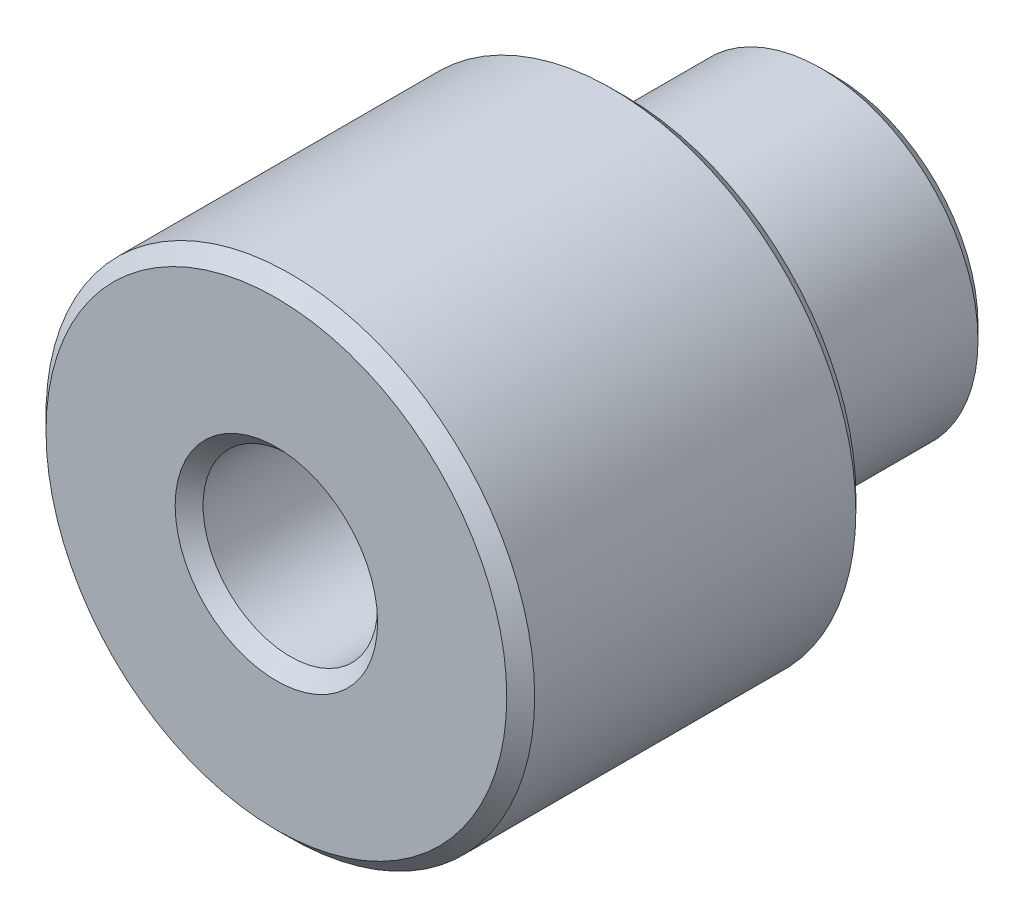
ISO-10303-21;
HEADER;
FILE_DESCRIPTION(('STEP AP214'),'2;1');
FILE_NAME('part.step','',(''),(''),'','','');
FILE_SCHEMA(('AUTOMOTIVE_DESIGN { 1 0 10303 214 1 1 1 1 }'));
ENDSEC;
DATA;
#1=APPLICATION_CONTEXT('core data for automotive mechanical design processes');
#2=APPLICATION_PROTOCOL_DEFINITION('international standard','automotive_design',2000,#1);
#3=PRODUCT_CONTEXT('',#1,'mechanical');
#4=PRODUCT('Part','Part','',(#3));
#5=PRODUCT_RELATED_PRODUCT_CATEGORY('part','',(#4));
#6=PRODUCT_DEFINITION_FORMATION('','',#4);
#7=PRODUCT_DEFINITION_CONTEXT('part definition',#1,'design');
#8=PRODUCT_DEFINITION('design','',#6,#7);
#9=PRODUCT_DEFINITION_SHAPE('','',#8);
#10=(LENGTH_UNIT() NAMED_UNIT(*) SI_UNIT(.MILLI.,.METRE.));
#11=(NAMED_UNIT(*) PLANE_ANGLE_UNIT() SI_UNIT($,.RADIAN.));
#12=(NAMED_UNIT(*) SI_UNIT($,.STERADIAN.) SOLID_ANGLE_UNIT());
#13=UNCERTAINTY_MEASURE_WITH_UNIT(LENGTH_MEASURE(1.E-05),#10,'distance_accuracy_value','');
#14=(GEOMETRIC_REPRESENTATION_CONTEXT(3) GLOBAL_UNCERTAINTY_ASSIGNED_CONTEXT((#13)) GLOBAL_UNIT_ASSIGNED_CONTEXT((#10,
#11,#12)) REPRESENTATION_CONTEXT('',''));
#15=CARTESIAN_POINT('',(0.,0.,0.));
#16=DIRECTION('',(0.,0.,1.));
#17=DIRECTION('',(1.,0.,0.));
#18=AXIS2_PLACEMENT_3D('',#15,#16,#17);
#19=CARTESIAN_POINT('',(0.,0.,0.));
#20=DIRECTION('',(0.,0.,1.));
#21=DIRECTION('',(1.,0.,0.));
#22=AXIS2_PLACEMENT_3D('',#19,#20,#21);
#23=PLANE('',#22);
#24=CARTESIAN_POINT('',(0.,0.,0.));
#25=DIRECTION('',(0.,0.,1.));
#26=DIRECTION('',(1.,0.,0.));
#27=AXIS2_PLACEMENT_3D('',#24,#25,#26);
#28=CIRCLE('',#27,3.3);
#29=CARTESIAN_POINT('',(3.3,0.,0.));
#30=VERTEX_POINT('',#29);
#31=EDGE_CURVE('E56',#30,#30,#28,.F.);
#32=ORIENTED_EDGE('',*,*,#31,.T.);
#33=EDGE_LOOP('',(#32));
#34=FACE_BOUND('',#33,.T.);
#35=CARTESIAN_POINT('',(0.,0.,0.));
#36=DIRECTION('',(0.,0.,1.));
#37=DIRECTION('',(1.,0.,0.));
#38=AXIS2_PLACEMENT_3D('',#35,#36,#37);
#39=CIRCLE('',#38,2.25);
#40=CARTESIAN_POINT('',(2.25,0.,0.));
#41=VERTEX_POINT('',#40);
#42=EDGE_CURVE('E71',#41,#41,#39,.F.);
#43=ORIENTED_EDGE('',*,*,#42,.F.);
#44=EDGE_LOOP('',(#43));
#45=FACE_BOUND('',#44,.T.);
#46=ADVANCED_FACE('F33',(#34,#45),#23,.F.);
#47=CARTESIAN_POINT('',(0.,0.,5.));
#48=DIRECTION('',(0.,0.,-1.));
#49=DIRECTION('',(-1.,0.,0.));
#50=AXIS2_PLACEMENT_3D('',#47,#48,#49);
#51=CYLINDRICAL_SURFACE('',#50,3.5);
#52=CARTESIAN_POINT('',(0.,0.,0.199999999999998));
#53=DIRECTION('',(0.,0.,1.));
#54=DIRECTION('',(1.,0.,0.));
#55=AXIS2_PLACEMENT_3D('',#52,#53,#54);
#56=CIRCLE('',#55,3.5);
#57=CARTESIAN_POINT('',(3.5,0.,0.199999999999998));
#58=VERTEX_POINT('',#57);
#59=EDGE_CURVE('E59',#58,#58,#56,.T.);
#60=ORIENTED_EDGE('',*,*,#59,.T.);
#61=EDGE_LOOP('',(#60));
#62=FACE_BOUND('',#61,.T.);
#63=CARTESIAN_POINT('',(0.,0.,4.8));
#64=DIRECTION('',(0.,0.,1.));
#65=DIRECTION('',(1.,0.,0.));
#66=AXIS2_PLACEMENT_3D('',#63,#64,#65);
#67=CIRCLE('',#66,3.5);
#68=CARTESIAN_POINT('',(3.5,0.,4.8));
#69=VERTEX_POINT('',#68);
#70=EDGE_CURVE('E62',#69,#69,#67,.F.);
#71=ORIENTED_EDGE('',*,*,#70,.T.);
#72=EDGE_LOOP('',(#71));
#73=FACE_BOUND('',#72,.T.);
#74=ADVANCED_FACE('F78',(#62,#73),#51,.T.);
#75=CARTESIAN_POINT('',(0.,0.,5.));
#76=DIRECTION('',(0.,0.,1.));
#77=DIRECTION('',(1.,0.,0.));
#78=AXIS2_PLACEMENT_3D('',#75,#76,#77);
#79=PLANE('',#78);
#80=CARTESIAN_POINT('',(0.,0.,5.));
#81=DIRECTION('',(0.,0.,1.));
#82=DIRECTION('',(1.,0.,0.));
#83=AXIS2_PLACEMENT_3D('',#80,#81,#82);
#84=CIRCLE('',#83,1.45);
#85=CARTESIAN_POINT('',(1.45,0.,5.));
#86=VERTEX_POINT('',#85);
#87=EDGE_CURVE('E10',#86,#86,#84,.F.);
#88=ORIENTED_EDGE('',*,*,#87,.T.);
#89=EDGE_LOOP('',(#88));
#90=FACE_BOUND('',#89,.T.);
#91=CARTESIAN_POINT('',(0.,0.,5.));
#92=DIRECTION('',(0.,0.,1.));
#93=DIRECTION('',(1.,0.,0.));
#94=AXIS2_PLACEMENT_3D('',#91,#92,#93);
#95=CIRCLE('',#94,3.3);
#96=CARTESIAN_POINT('',(3.3,0.,5.));
#97=VERTEX_POINT('',#96);
#98=EDGE_CURVE('E53',#97,#97,#95,.T.);
#99=ORIENTED_EDGE('',*,*,#98,.T.);
#100=EDGE_LOOP('',(#99));
#101=FACE_BOUND('',#100,.T.);
#102=ADVANCED_FACE('F84',(#90,#101),#79,.T.);
#103=CARTESIAN_POINT('',(0.,0.,-3.));
#104=DIRECTION('',(0.,0.,1.));
#105=DIRECTION('',(1.,0.,0.));
#106=AXIS2_PLACEMENT_3D('',#103,#104,#105);
#107=CYLINDRICAL_SURFACE('',#106,2.25);
#108=CARTESIAN_POINT('',(0.,0.,-2.8));
#109=DIRECTION('',(0.,0.,-1.));
#110=DIRECTION('',(-1.,0.,0.));
#111=AXIS2_PLACEMENT_3D('',#108,#109,#110);
#112=CIRCLE('',#111,2.25);
#113=CARTESIAN_POINT('',(-2.25,0.,-2.8));
#114=VERTEX_POINT('',#113);
#115=EDGE_CURVE('E65',#114,#114,#112,.F.);
#116=ORIENTED_EDGE('',*,*,#115,.T.);
#117=EDGE_LOOP('',(#116));
#118=FACE_BOUND('',#117,.T.);
#119=ORIENTED_EDGE('',*,*,#42,.T.);
#120=EDGE_LOOP('',(#119));
#121=FACE_BOUND('',#120,.T.);
#122=ADVANCED_FACE('F75',(#118,#121),#107,.T.);
#123=CARTESIAN_POINT('',(0.,0.,-3.));
#124=DIRECTION('',(0.,0.,-1.));
#125=DIRECTION('',(-1.,0.,0.));
#126=AXIS2_PLACEMENT_3D('',#123,#124,#125);
#127=PLANE('',#126);
#128=CARTESIAN_POINT('',(0.,0.,-3.));
#129=DIRECTION('',(0.,0.,-1.));
#130=DIRECTION('',(-1.,0.,0.));
#131=AXIS2_PLACEMENT_3D('',#128,#129,#130);
#132=CIRCLE('',#131,1.45);
#133=CARTESIAN_POINT('',(-1.45,0.,-3.));
#134=VERTEX_POINT('',#133);
#135=EDGE_CURVE('E40',#134,#134,#132,.F.);
#136=ORIENTED_EDGE('',*,*,#135,.T.);
#137=EDGE_LOOP('',(#136));
#138=FACE_BOUND('',#137,.T.);
#139=CARTESIAN_POINT('',(0.,0.,-3.));
#140=DIRECTION('',(0.,0.,-1.));
#141=DIRECTION('',(-1.,0.,0.));
#142=AXIS2_PLACEMENT_3D('',#139,#140,#141);
#143=CIRCLE('',#142,2.05);
#144=CARTESIAN_POINT('',(-2.05,0.,-3.));
#145=VERTEX_POINT('',#144);
#146=EDGE_CURVE('E68',#145,#145,#143,.T.);
#147=ORIENTED_EDGE('',*,*,#146,.T.);
#148=EDGE_LOOP('',(#147));
#149=FACE_BOUND('',#148,.T.);
#150=ADVANCED_FACE('F94',(#138,#149),#127,.T.);
#151=CARTESIAN_POINT('',(0.,0.,-3.));
#152=DIRECTION('',(0.,0.,1.));
#153=DIRECTION('',(1.,0.,0.));
#154=AXIS2_PLACEMENT_3D('',#151,#152,#153);
#155=CONICAL_SURFACE('',#154,2.05,0.785398163397441);
#156=ORIENTED_EDGE('',*,*,#115,.F.);
#157=EDGE_LOOP('',(#156));
#158=FACE_BOUND('',#157,.T.);
#159=ORIENTED_EDGE('',*,*,#146,.F.);
#160=EDGE_LOOP('',(#159));
#161=FACE_BOUND('',#160,.T.);
#162=ADVANCED_FACE('F90',(#158,#161),#155,.T.);
#163=CARTESIAN_POINT('',(0.,0.,0.199999999999998));
#164=DIRECTION('',(0.,0.,1.));
#165=DIRECTION('',(1.,0.,0.));
#166=AXIS2_PLACEMENT_3D('',#163,#164,#165);
#167=CONICAL_SURFACE('',#166,3.5,0.785398163397449);
#168=ORIENTED_EDGE('',*,*,#31,.F.);
#169=EDGE_LOOP('',(#168));
#170=FACE_BOUND('',#169,.T.);
#171=ORIENTED_EDGE('',*,*,#59,.F.);
#172=EDGE_LOOP('',(#171));
#173=FACE_BOUND('',#172,.T.);
#174=ADVANCED_FACE('F93',(#170,#173),#167,.T.);
#175=CARTESIAN_POINT('',(0.,0.,5.));
#176=DIRECTION('',(0.,0.,-1.));
#177=DIRECTION('',(-1.,0.,0.));
#178=AXIS2_PLACEMENT_3D('',#175,#176,#177);
#179=CONICAL_SURFACE('',#178,3.3,0.785398163397441);
#180=ORIENTED_EDGE('',*,*,#70,.F.);
#181=EDGE_LOOP('',(#180));
#182=FACE_BOUND('',#181,.T.);
#183=ORIENTED_EDGE('',*,*,#98,.F.);
#184=EDGE_LOOP('',(#183));
#185=FACE_BOUND('',#184,.T.);
#186=ADVANCED_FACE('F98',(#182,#185),#179,.T.);
#187=CARTESIAN_POINT('',(0.,0.,-4.));
#188=DIRECTION('',(0.,0.,1.));
#189=DIRECTION('',(1.,0.,0.));
#190=AXIS2_PLACEMENT_3D('',#187,#188,#189);
#191=CYLINDRICAL_SURFACE('',#190,1.25);
#192=CARTESIAN_POINT('',(0.,0.,-2.8));
#193=DIRECTION('',(0.,0.,-1.));
#194=DIRECTION('',(-1.,0.,0.));
#195=AXIS2_PLACEMENT_3D('',#192,#193,#194);
#196=CIRCLE('',#195,1.25);
#197=CARTESIAN_POINT('',(-1.25,0.,-2.8));
#198=VERTEX_POINT('',#197);
#199=EDGE_CURVE('E44',#198,#198,#196,.T.);
#200=ORIENTED_EDGE('',*,*,#199,.T.);
#201=EDGE_LOOP('',(#200));
#202=FACE_BOUND('',#201,.T.);
#203=CARTESIAN_POINT('',(0.,0.,4.8));
#204=DIRECTION('',(0.,0.,1.));
#205=DIRECTION('',(1.,0.,0.));
#206=AXIS2_PLACEMENT_3D('',#203,#204,#205);
#207=CIRCLE('',#206,1.25);
#208=CARTESIAN_POINT('',(1.25,0.,4.8));
#209=VERTEX_POINT('',#208);
#210=EDGE_CURVE('E48',#209,#209,#207,.T.);
#211=ORIENTED_EDGE('',*,*,#210,.T.);
#212=EDGE_LOOP('',(#211));
#213=FACE_BOUND('',#212,.T.);
#214=ADVANCED_FACE('F101',(#202,#213),#191,.F.);
#215=CARTESIAN_POINT('',(0.,0.,-2.8));
#216=DIRECTION('',(0.,0.,-1.));
#217=DIRECTION('',(-1.,0.,0.));
#218=AXIS2_PLACEMENT_3D('',#215,#216,#217);
#219=CONICAL_SURFACE('',#218,1.25,0.785398163397453);
#220=ORIENTED_EDGE('',*,*,#135,.F.);
#221=EDGE_LOOP('',(#220));
#222=FACE_BOUND('',#221,.T.);
#223=ORIENTED_EDGE('',*,*,#199,.F.);
#224=EDGE_LOOP('',(#223));
#225=FACE_BOUND('',#224,.T.);
#226=ADVANCED_FACE('F103',(#222,#225),#219,.F.);
#227=CARTESIAN_POINT('',(0.,0.,4.8));
#228=DIRECTION('',(0.,0.,1.));
#229=DIRECTION('',(1.,0.,0.));
#230=AXIS2_PLACEMENT_3D('',#227,#228,#229);
#231=CONICAL_SURFACE('',#230,1.25,0.785398163397447);
#232=ORIENTED_EDGE('',*,*,#87,.F.);
#233=EDGE_LOOP('',(#232));
#234=FACE_BOUND('',#233,.T.);
#235=ORIENTED_EDGE('',*,*,#210,.F.);
#236=EDGE_LOOP('',(#235));
#237=FACE_BOUND('',#236,.T.);
#238=ADVANCED_FACE('F35',(#234,#237),#231,.F.);
#239=CLOSED_SHELL('',(#46,#74,#102,#122,#150,#162,#174,#186,#214,#226,#238));
#240=MANIFOLD_SOLID_BREP('B2',#239);
#241=ADVANCED_BREP_SHAPE_REPRESENTATION('',(#18,#240),#14);
#242=SHAPE_DEFINITION_REPRESENTATION(#9,#241);
ENDSEC;
END-ISO-10303-21;
